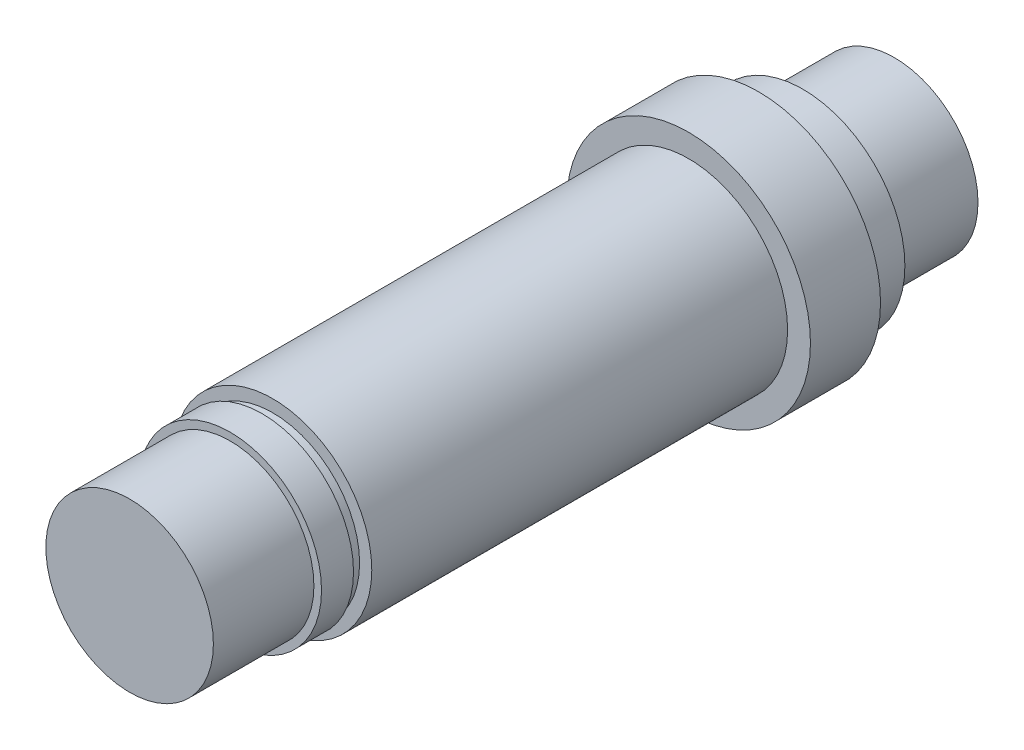
ISO-10303-21;
HEADER;
FILE_DESCRIPTION(('STEP AP214'),'2;1');
FILE_NAME('part.step','',(''),(''),'','','');
FILE_SCHEMA(('AUTOMOTIVE_DESIGN { 1 0 10303 214 1 1 1 1 }'));
ENDSEC;
DATA;
#1=APPLICATION_CONTEXT('core data for automotive mechanical design processes');
#2=APPLICATION_PROTOCOL_DEFINITION('international standard','automotive_design',2000,#1);
#3=PRODUCT_CONTEXT('',#1,'mechanical');
#4=PRODUCT('Part','Part','',(#3));
#5=PRODUCT_RELATED_PRODUCT_CATEGORY('part','',(#4));
#6=PRODUCT_DEFINITION_FORMATION('','',#4);
#7=PRODUCT_DEFINITION_CONTEXT('part definition',#1,'design');
#8=PRODUCT_DEFINITION('design','',#6,#7);
#9=PRODUCT_DEFINITION_SHAPE('','',#8);
#10=(LENGTH_UNIT() NAMED_UNIT(*) SI_UNIT(.MILLI.,.METRE.));
#11=(NAMED_UNIT(*) PLANE_ANGLE_UNIT() SI_UNIT($,.RADIAN.));
#12=(NAMED_UNIT(*) SI_UNIT($,.STERADIAN.) SOLID_ANGLE_UNIT());
#13=UNCERTAINTY_MEASURE_WITH_UNIT(LENGTH_MEASURE(1.E-05),#10,'distance_accuracy_value','');
#14=(GEOMETRIC_REPRESENTATION_CONTEXT(3) GLOBAL_UNCERTAINTY_ASSIGNED_CONTEXT((#13)) GLOBAL_UNIT_ASSIGNED_CONTEXT((#10,
#11,#12)) REPRESENTATION_CONTEXT('',''));
#15=CARTESIAN_POINT('',(0.,0.,0.));
#16=DIRECTION('',(0.,0.,1.));
#17=DIRECTION('',(1.,0.,0.));
#18=AXIS2_PLACEMENT_3D('',#15,#16,#17);
#19=CARTESIAN_POINT('',(0.,0.,0.));
#20=DIRECTION('',(0.,0.,-1.));
#21=DIRECTION('',(-1.,0.,0.));
#22=AXIS2_PLACEMENT_3D('',#19,#20,#21);
#23=PLANE('',#22);
#24=CARTESIAN_POINT('',(0.,0.,0.));
#25=DIRECTION('',(0.,0.,1.));
#26=DIRECTION('',(1.,0.,0.));
#27=AXIS2_PLACEMENT_3D('',#24,#25,#26);
#28=CIRCLE('',#27,27.5);
#29=CARTESIAN_POINT('',(27.5,0.,0.));
#30=VERTEX_POINT('',#29);
#31=EDGE_CURVE('E10',#30,#30,#28,.T.);
#32=ORIENTED_EDGE('',*,*,#31,.T.);
#33=EDGE_LOOP('',(#32));
#34=FACE_BOUND('',#33,.T.);
#35=ADVANCED_FACE('F30',(#34),#23,.F.);
#36=CARTESIAN_POINT('',(0.,0.,1000.));
#37=DIRECTION('',(0.,0.,1.));
#38=DIRECTION('',(1.,0.,0.));
#39=AXIS2_PLACEMENT_3D('',#36,#37,#38);
#40=CYLINDRICAL_SURFACE('',#39,27.5);
#41=ORIENTED_EDGE('',*,*,#31,.F.);
#42=EDGE_LOOP('',(#41));
#43=FACE_BOUND('',#42,.T.);
#44=CARTESIAN_POINT('',(0.,0.,-32.9999999999999));
#45=DIRECTION('',(0.,0.,1.));
#46=DIRECTION('',(1.,0.,0.));
#47=AXIS2_PLACEMENT_3D('',#44,#45,#46);
#48=CIRCLE('',#47,27.5);
#49=CARTESIAN_POINT('',(27.5,0.,-32.9999999999999));
#50=VERTEX_POINT('',#49);
#51=EDGE_CURVE('E36',#50,#50,#48,.T.);
#52=ORIENTED_EDGE('',*,*,#51,.T.);
#53=EDGE_LOOP('',(#52));
#54=FACE_BOUND('',#53,.T.);
#55=ADVANCED_FACE('F92',(#43,#54),#40,.T.);
#56=CARTESIAN_POINT('',(0.,27.5,-33.));
#57=DIRECTION('',(0.,0.,-1.));
#58=DIRECTION('',(-1.,0.,0.));
#59=AXIS2_PLACEMENT_3D('',#56,#57,#58);
#60=PLANE('',#59);
#61=ORIENTED_EDGE('',*,*,#51,.F.);
#62=EDGE_LOOP('',(#61));
#63=FACE_BOUND('',#62,.T.);
#64=CARTESIAN_POINT('',(0.,0.,-32.9999999999999));
#65=DIRECTION('',(0.,0.,1.));
#66=DIRECTION('',(1.,0.,0.));
#67=AXIS2_PLACEMENT_3D('',#64,#65,#66);
#68=CIRCLE('',#67,30.);
#69=CARTESIAN_POINT('',(30.,0.,-32.9999999999999));
#70=VERTEX_POINT('',#69);
#71=EDGE_CURVE('E40',#70,#70,#68,.T.);
#72=ORIENTED_EDGE('',*,*,#71,.T.);
#73=EDGE_LOOP('',(#72));
#74=FACE_BOUND('',#73,.T.);
#75=ADVANCED_FACE('F96',(#63,#74),#60,.F.);
#76=CARTESIAN_POINT('',(0.,0.,1000.));
#77=DIRECTION('',(0.,0.,1.));
#78=DIRECTION('',(1.,0.,0.));
#79=AXIS2_PLACEMENT_3D('',#76,#77,#78);
#80=CYLINDRICAL_SURFACE('',#79,30.);
#81=ORIENTED_EDGE('',*,*,#71,.F.);
#82=EDGE_LOOP('',(#81));
#83=FACE_BOUND('',#82,.T.);
#84=CARTESIAN_POINT('',(0.,0.,-43.5000000000001));
#85=DIRECTION('',(0.,0.,1.));
#86=DIRECTION('',(1.,0.,0.));
#87=AXIS2_PLACEMENT_3D('',#84,#85,#86);
#88=CIRCLE('',#87,30.);
#89=CARTESIAN_POINT('',(30.,0.,-43.5000000000001));
#90=VERTEX_POINT('',#89);
#91=EDGE_CURVE('E44',#90,#90,#88,.T.);
#92=ORIENTED_EDGE('',*,*,#91,.T.);
#93=EDGE_LOOP('',(#92));
#94=FACE_BOUND('',#93,.T.);
#95=ADVANCED_FACE('F101',(#83,#94),#80,.T.);
#96=CARTESIAN_POINT('',(0.,30.,-43.5));
#97=DIRECTION('',(0.,0.,1.));
#98=DIRECTION('',(1.,0.,0.));
#99=AXIS2_PLACEMENT_3D('',#96,#97,#98);
#100=PLANE('',#99);
#101=ORIENTED_EDGE('',*,*,#91,.F.);
#102=EDGE_LOOP('',(#101));
#103=FACE_BOUND('',#102,.T.);
#104=CARTESIAN_POINT('',(0.,0.,-43.5000000000001));
#105=DIRECTION('',(0.,0.,1.));
#106=DIRECTION('',(1.,0.,0.));
#107=AXIS2_PLACEMENT_3D('',#104,#105,#106);
#108=CIRCLE('',#107,28.5);
#109=CARTESIAN_POINT('',(28.5,0.,-43.5000000000001));
#110=VERTEX_POINT('',#109);
#111=EDGE_CURVE('E49',#110,#110,#108,.T.);
#112=ORIENTED_EDGE('',*,*,#111,.T.);
#113=EDGE_LOOP('',(#112));
#114=FACE_BOUND('',#113,.T.);
#115=ADVANCED_FACE('F107',(#103,#114),#100,.F.);
#116=CARTESIAN_POINT('',(0.,0.,1000.));
#117=DIRECTION('',(0.,0.,1.));
#118=DIRECTION('',(1.,0.,0.));
#119=AXIS2_PLACEMENT_3D('',#116,#117,#118);
#120=CYLINDRICAL_SURFACE('',#119,28.5);
#121=ORIENTED_EDGE('',*,*,#111,.F.);
#122=EDGE_LOOP('',(#121));
#123=FACE_BOUND('',#122,.T.);
#124=CARTESIAN_POINT('',(0.,0.,-46.9999999999999));
#125=DIRECTION('',(0.,0.,1.));
#126=DIRECTION('',(1.,0.,0.));
#127=AXIS2_PLACEMENT_3D('',#124,#125,#126);
#128=CIRCLE('',#127,28.5);
#129=CARTESIAN_POINT('',(28.5,0.,-46.9999999999999));
#130=VERTEX_POINT('',#129);
#131=EDGE_CURVE('E52',#130,#130,#128,.T.);
#132=ORIENTED_EDGE('',*,*,#131,.T.);
#133=EDGE_LOOP('',(#132));
#134=FACE_BOUND('',#133,.T.);
#135=ADVANCED_FACE('F111',(#123,#134),#120,.T.);
#136=CARTESIAN_POINT('',(0.,28.5,-47.));
#137=DIRECTION('',(0.,0.,-1.));
#138=DIRECTION('',(-1.,0.,0.));
#139=AXIS2_PLACEMENT_3D('',#136,#137,#138);
#140=PLANE('',#139);
#141=ORIENTED_EDGE('',*,*,#131,.F.);
#142=EDGE_LOOP('',(#141));
#143=FACE_BOUND('',#142,.T.);
#144=CARTESIAN_POINT('',(0.,0.,-46.9999999999999));
#145=DIRECTION('',(0.,0.,1.));
#146=DIRECTION('',(1.,0.,0.));
#147=AXIS2_PLACEMENT_3D('',#144,#145,#146);
#148=CIRCLE('',#147,32.5);
#149=CARTESIAN_POINT('',(32.5,0.,-46.9999999999999));
#150=VERTEX_POINT('',#149);
#151=EDGE_CURVE('E55',#150,#150,#148,.T.);
#152=ORIENTED_EDGE('',*,*,#151,.T.);
#153=EDGE_LOOP('',(#152));
#154=FACE_BOUND('',#153,.T.);
#155=ADVANCED_FACE('F115',(#143,#154),#140,.F.);
#156=CARTESIAN_POINT('',(0.,0.,1000.));
#157=DIRECTION('',(0.,0.,1.));
#158=DIRECTION('',(1.,0.,0.));
#159=AXIS2_PLACEMENT_3D('',#156,#157,#158);
#160=CYLINDRICAL_SURFACE('',#159,32.5);
#161=ORIENTED_EDGE('',*,*,#151,.F.);
#162=EDGE_LOOP('',(#161));
#163=FACE_BOUND('',#162,.T.);
#164=CARTESIAN_POINT('',(0.,0.,-183.5));
#165=DIRECTION('',(0.,0.,1.));
#166=DIRECTION('',(1.,0.,0.));
#167=AXIS2_PLACEMENT_3D('',#164,#165,#166);
#168=CIRCLE('',#167,32.5);
#169=CARTESIAN_POINT('',(32.5,0.,-183.5));
#170=VERTEX_POINT('',#169);
#171=EDGE_CURVE('E58',#170,#170,#168,.T.);
#172=ORIENTED_EDGE('',*,*,#171,.T.);
#173=EDGE_LOOP('',(#172));
#174=FACE_BOUND('',#173,.T.);
#175=ADVANCED_FACE('F119',(#163,#174),#160,.T.);
#176=CARTESIAN_POINT('',(0.,32.5,-183.5));
#177=DIRECTION('',(0.,0.,-1.));
#178=DIRECTION('',(-1.,0.,0.));
#179=AXIS2_PLACEMENT_3D('',#176,#177,#178);
#180=PLANE('',#179);
#181=ORIENTED_EDGE('',*,*,#171,.F.);
#182=EDGE_LOOP('',(#181));
#183=FACE_BOUND('',#182,.T.);
#184=CARTESIAN_POINT('',(0.,0.,-183.5));
#185=DIRECTION('',(0.,0.,1.));
#186=DIRECTION('',(1.,0.,0.));
#187=AXIS2_PLACEMENT_3D('',#184,#185,#186);
#188=CIRCLE('',#187,40.);
#189=CARTESIAN_POINT('',(40.,0.,-183.5));
#190=VERTEX_POINT('',#189);
#191=EDGE_CURVE('E61',#190,#190,#188,.T.);
#192=ORIENTED_EDGE('',*,*,#191,.T.);
#193=EDGE_LOOP('',(#192));
#194=FACE_BOUND('',#193,.T.);
#195=ADVANCED_FACE('F123',(#183,#194),#180,.F.);
#196=CARTESIAN_POINT('',(0.,0.,1000.));
#197=DIRECTION('',(0.,0.,1.));
#198=DIRECTION('',(1.,0.,0.));
#199=AXIS2_PLACEMENT_3D('',#196,#197,#198);
#200=CYLINDRICAL_SURFACE('',#199,40.);
#201=ORIENTED_EDGE('',*,*,#191,.F.);
#202=EDGE_LOOP('',(#201));
#203=FACE_BOUND('',#202,.T.);
#204=CARTESIAN_POINT('',(0.,0.,-206.5));
#205=DIRECTION('',(0.,0.,1.));
#206=DIRECTION('',(1.,0.,0.));
#207=AXIS2_PLACEMENT_3D('',#204,#205,#206);
#208=CIRCLE('',#207,40.);
#209=CARTESIAN_POINT('',(40.,0.,-206.5));
#210=VERTEX_POINT('',#209);
#211=EDGE_CURVE('E64',#210,#210,#208,.T.);
#212=ORIENTED_EDGE('',*,*,#211,.T.);
#213=EDGE_LOOP('',(#212));
#214=FACE_BOUND('',#213,.T.);
#215=ADVANCED_FACE('F127',(#203,#214),#200,.T.);
#216=CARTESIAN_POINT('',(0.,40.,-206.5));
#217=DIRECTION('',(0.,0.,1.));
#218=DIRECTION('',(1.,0.,0.));
#219=AXIS2_PLACEMENT_3D('',#216,#217,#218);
#220=PLANE('',#219);
#221=ORIENTED_EDGE('',*,*,#211,.F.);
#222=EDGE_LOOP('',(#221));
#223=FACE_BOUND('',#222,.T.);
#224=CARTESIAN_POINT('',(0.,0.,-206.5));
#225=DIRECTION('',(0.,0.,1.));
#226=DIRECTION('',(1.,0.,0.));
#227=AXIS2_PLACEMENT_3D('',#224,#225,#226);
#228=CIRCLE('',#227,33.5);
#229=CARTESIAN_POINT('',(33.5,0.,-206.5));
#230=VERTEX_POINT('',#229);
#231=EDGE_CURVE('E67',#230,#230,#228,.T.);
#232=ORIENTED_EDGE('',*,*,#231,.T.);
#233=EDGE_LOOP('',(#232));
#234=FACE_BOUND('',#233,.T.);
#235=ADVANCED_FACE('F131',(#223,#234),#220,.F.);
#236=CARTESIAN_POINT('',(0.,0.,1000.));
#237=DIRECTION('',(0.,0.,1.));
#238=DIRECTION('',(1.,0.,0.));
#239=AXIS2_PLACEMENT_3D('',#236,#237,#238);
#240=CYLINDRICAL_SURFACE('',#239,33.5);
#241=ORIENTED_EDGE('',*,*,#231,.F.);
#242=EDGE_LOOP('',(#241));
#243=FACE_BOUND('',#242,.T.);
#244=CARTESIAN_POINT('',(0.,0.,-221.));
#245=DIRECTION('',(0.,0.,1.));
#246=DIRECTION('',(1.,0.,0.));
#247=AXIS2_PLACEMENT_3D('',#244,#245,#246);
#248=CIRCLE('',#247,33.5);
#249=CARTESIAN_POINT('',(33.5,0.,-221.));
#250=VERTEX_POINT('',#249);
#251=EDGE_CURVE('E70',#250,#250,#248,.T.);
#252=ORIENTED_EDGE('',*,*,#251,.T.);
#253=EDGE_LOOP('',(#252));
#254=FACE_BOUND('',#253,.T.);
#255=ADVANCED_FACE('F135',(#243,#254),#240,.T.);
#256=CARTESIAN_POINT('',(0.,33.5,-221.));
#257=DIRECTION('',(0.,0.,1.));
#258=DIRECTION('',(1.,0.,0.));
#259=AXIS2_PLACEMENT_3D('',#256,#257,#258);
#260=PLANE('',#259);
#261=ORIENTED_EDGE('',*,*,#251,.F.);
#262=EDGE_LOOP('',(#261));
#263=FACE_BOUND('',#262,.T.);
#264=CARTESIAN_POINT('',(0.,0.,-221.));
#265=DIRECTION('',(0.,0.,1.));
#266=DIRECTION('',(1.,0.,0.));
#267=AXIS2_PLACEMENT_3D('',#264,#265,#266);
#268=CIRCLE('',#267,27.5);
#269=CARTESIAN_POINT('',(27.5,0.,-221.));
#270=VERTEX_POINT('',#269);
#271=EDGE_CURVE('E73',#270,#270,#268,.T.);
#272=ORIENTED_EDGE('',*,*,#271,.T.);
#273=EDGE_LOOP('',(#272));
#274=FACE_BOUND('',#273,.T.);
#275=ADVANCED_FACE('F88',(#263,#274),#260,.F.);
#276=CARTESIAN_POINT('',(0.,0.,1000.));
#277=DIRECTION('',(0.,0.,1.));
#278=DIRECTION('',(1.,0.,0.));
#279=AXIS2_PLACEMENT_3D('',#276,#277,#278);
#280=CYLINDRICAL_SURFACE('',#279,27.5);
#281=ORIENTED_EDGE('',*,*,#271,.F.);
#282=EDGE_LOOP('',(#281));
#283=FACE_BOUND('',#282,.T.);
#284=CARTESIAN_POINT('',(0.,0.,-251.));
#285=DIRECTION('',(0.,0.,1.));
#286=DIRECTION('',(1.,0.,0.));
#287=AXIS2_PLACEMENT_3D('',#284,#285,#286);
#288=CIRCLE('',#287,27.5);
#289=CARTESIAN_POINT('',(27.5,0.,-251.));
#290=VERTEX_POINT('',#289);
#291=EDGE_CURVE('E76',#290,#290,#288,.T.);
#292=ORIENTED_EDGE('',*,*,#291,.T.);
#293=EDGE_LOOP('',(#292));
#294=FACE_BOUND('',#293,.T.);
#295=ADVANCED_FACE('F80',(#283,#294),#280,.T.);
#296=CARTESIAN_POINT('',(0.,27.5,-251.));
#297=DIRECTION('',(0.,0.,1.));
#298=DIRECTION('',(1.,0.,0.));
#299=AXIS2_PLACEMENT_3D('',#296,#297,#298);
#300=PLANE('',#299);
#301=ORIENTED_EDGE('',*,*,#291,.F.);
#302=EDGE_LOOP('',(#301));
#303=FACE_BOUND('',#302,.T.);
#304=ADVANCED_FACE('F82',(#303),#300,.F.);
#305=CLOSED_SHELL('',(#35,#55,#75,#95,#115,#135,#155,#175,#195,#215,#235,#255,#275,#295,#304));
#306=MANIFOLD_SOLID_BREP('B2',#305);
#307=ADVANCED_BREP_SHAPE_REPRESENTATION('',(#18,#306),#14);
#308=SHAPE_DEFINITION_REPRESENTATION(#9,#307);
ENDSEC;
END-ISO-10303-21;
